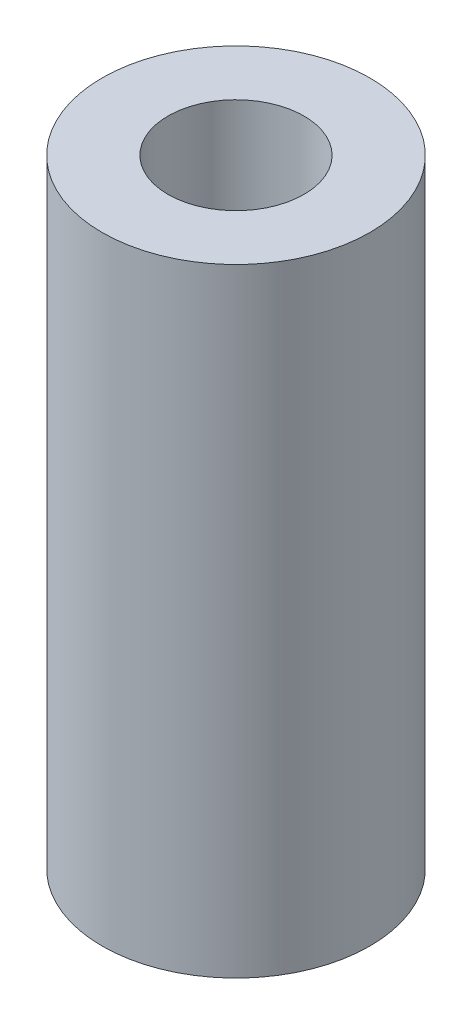
ISO-10303-21;
HEADER;
FILE_DESCRIPTION(('STEP AP214'),'2;1');
FILE_NAME('part.step','',(''),(''),'','','');
FILE_SCHEMA(('AUTOMOTIVE_DESIGN { 1 0 10303 214 1 1 1 1 }'));
ENDSEC;
DATA;
#1=APPLICATION_CONTEXT('core data for automotive mechanical design processes');
#2=APPLICATION_PROTOCOL_DEFINITION('international standard','automotive_design',2000,#1);
#3=PRODUCT_CONTEXT('',#1,'mechanical');
#4=PRODUCT('Part','Part','',(#3));
#5=PRODUCT_RELATED_PRODUCT_CATEGORY('part','',(#4));
#6=PRODUCT_DEFINITION_FORMATION('','',#4);
#7=PRODUCT_DEFINITION_CONTEXT('part definition',#1,'design');
#8=PRODUCT_DEFINITION('design','',#6,#7);
#9=PRODUCT_DEFINITION_SHAPE('','',#8);
#10=(LENGTH_UNIT() NAMED_UNIT(*) SI_UNIT(.MILLI.,.METRE.));
#11=(NAMED_UNIT(*) PLANE_ANGLE_UNIT() SI_UNIT($,.RADIAN.));
#12=(NAMED_UNIT(*) SI_UNIT($,.STERADIAN.) SOLID_ANGLE_UNIT());
#13=UNCERTAINTY_MEASURE_WITH_UNIT(LENGTH_MEASURE(1.E-05),#10,'distance_accuracy_value','');
#14=(GEOMETRIC_REPRESENTATION_CONTEXT(3) GLOBAL_UNCERTAINTY_ASSIGNED_CONTEXT((#13)) GLOBAL_UNIT_ASSIGNED_CONTEXT((#10,
#11,#12)) REPRESENTATION_CONTEXT('',''));
#15=CARTESIAN_POINT('',(0.,0.,0.));
#16=DIRECTION('',(0.,0.,1.));
#17=DIRECTION('',(1.,0.,0.));
#18=AXIS2_PLACEMENT_3D('',#15,#16,#17);
#19=CARTESIAN_POINT('',(0.,15.,0.));
#20=DIRECTION('',(0.,1.,0.));
#21=DIRECTION('',(0.,0.,1.));
#22=AXIS2_PLACEMENT_3D('',#19,#20,#21);
#23=PLANE('',#22);
#24=CARTESIAN_POINT('',(0.,15.,0.));
#25=DIRECTION('',(0.,1.,0.));
#26=DIRECTION('',(0.,0.,1.));
#27=AXIS2_PLACEMENT_3D('',#24,#25,#26);
#28=CIRCLE('',#27,3.25);
#29=CARTESIAN_POINT('',(0.,15.,3.25));
#30=VERTEX_POINT('',#29);
#31=EDGE_CURVE('E10',#30,#30,#28,.T.);
#32=ORIENTED_EDGE('',*,*,#31,.T.);
#33=EDGE_LOOP('',(#32));
#34=FACE_BOUND('',#33,.T.);
#35=CARTESIAN_POINT('',(0.,15.,0.));
#36=DIRECTION('',(0.,1.,0.));
#37=DIRECTION('',(0.,0.,1.));
#38=AXIS2_PLACEMENT_3D('',#35,#36,#37);
#39=CIRCLE('',#38,1.65);
#40=CARTESIAN_POINT('',(0.,15.,1.65));
#41=VERTEX_POINT('',#40);
#42=EDGE_CURVE('E41',#41,#41,#39,.T.);
#43=ORIENTED_EDGE('',*,*,#42,.F.);
#44=EDGE_LOOP('',(#43));
#45=FACE_BOUND('',#44,.T.);
#46=ADVANCED_FACE('F30',(#34,#45),#23,.T.);
#47=CARTESIAN_POINT('',(0.,0.,0.));
#48=DIRECTION('',(0.,1.,0.));
#49=DIRECTION('',(0.,0.,1.));
#50=AXIS2_PLACEMENT_3D('',#47,#48,#49);
#51=PLANE('',#50);
#52=CARTESIAN_POINT('',(0.,0.,0.));
#53=DIRECTION('',(0.,1.,0.));
#54=DIRECTION('',(0.,0.,1.));
#55=AXIS2_PLACEMENT_3D('',#52,#53,#54);
#56=CIRCLE('',#55,3.25);
#57=CARTESIAN_POINT('',(0.,0.,3.25));
#58=VERTEX_POINT('',#57);
#59=EDGE_CURVE('E34',#58,#58,#56,.T.);
#60=ORIENTED_EDGE('',*,*,#59,.F.);
#61=EDGE_LOOP('',(#60));
#62=FACE_BOUND('',#61,.T.);
#63=CARTESIAN_POINT('',(0.,0.,0.));
#64=DIRECTION('',(0.,1.,0.));
#65=DIRECTION('',(0.,0.,1.));
#66=AXIS2_PLACEMENT_3D('',#63,#64,#65);
#67=CIRCLE('',#66,1.65);
#68=CARTESIAN_POINT('',(0.,0.,1.65));
#69=VERTEX_POINT('',#68);
#70=EDGE_CURVE('E43',#69,#69,#67,.T.);
#71=ORIENTED_EDGE('',*,*,#70,.T.);
#72=EDGE_LOOP('',(#71));
#73=FACE_BOUND('',#72,.T.);
#74=ADVANCED_FACE('F53',(#62,#73),#51,.F.);
#75=CARTESIAN_POINT('',(0.,15.,0.));
#76=DIRECTION('',(0.,-1.,0.));
#77=DIRECTION('',(0.,0.,-1.));
#78=AXIS2_PLACEMENT_3D('',#75,#76,#77);
#79=CYLINDRICAL_SURFACE('',#78,3.25);
#80=ORIENTED_EDGE('',*,*,#31,.F.);
#81=EDGE_LOOP('',(#80));
#82=FACE_BOUND('',#81,.T.);
#83=ORIENTED_EDGE('',*,*,#59,.T.);
#84=EDGE_LOOP('',(#83));
#85=FACE_BOUND('',#84,.T.);
#86=ADVANCED_FACE('F32',(#82,#85),#79,.T.);
#87=CARTESIAN_POINT('',(0.,15.,0.));
#88=DIRECTION('',(0.,-1.,0.));
#89=DIRECTION('',(0.,0.,-1.));
#90=AXIS2_PLACEMENT_3D('',#87,#88,#89);
#91=CYLINDRICAL_SURFACE('',#90,1.65);
#92=ORIENTED_EDGE('',*,*,#42,.T.);
#93=EDGE_LOOP('',(#92));
#94=FACE_BOUND('',#93,.T.);
#95=ORIENTED_EDGE('',*,*,#70,.F.);
#96=EDGE_LOOP('',(#95));
#97=FACE_BOUND('',#96,.T.);
#98=ADVANCED_FACE('F49',(#94,#97),#91,.F.);
#99=CLOSED_SHELL('',(#46,#74,#86,#98));
#100=MANIFOLD_SOLID_BREP('B2',#99);
#101=ADVANCED_BREP_SHAPE_REPRESENTATION('',(#18,#100),#14);
#102=SHAPE_DEFINITION_REPRESENTATION(#9,#101);
ENDSEC;
END-ISO-10303-21;
